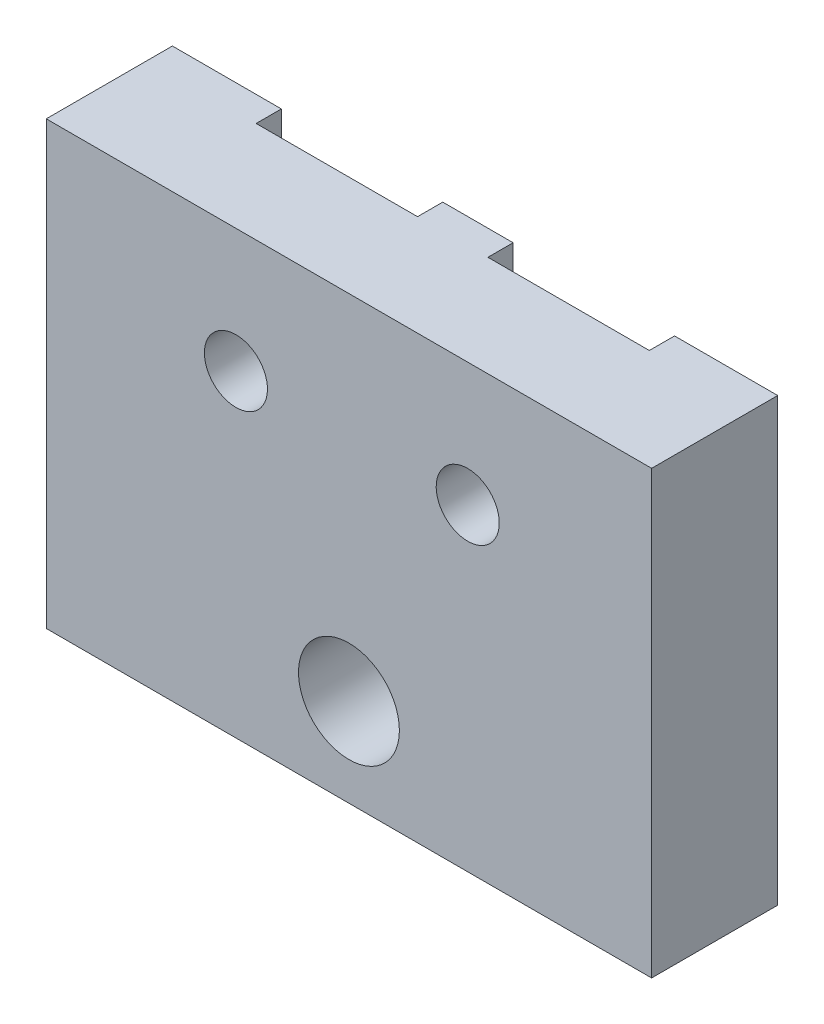
ISO-10303-21;
HEADER;
FILE_DESCRIPTION(('STEP AP214'),'2;1');
FILE_NAME('part.step','',(''),(''),'','','');
FILE_SCHEMA(('AUTOMOTIVE_DESIGN { 1 0 10303 214 1 1 1 1 }'));
ENDSEC;
DATA;
#1=APPLICATION_CONTEXT('core data for automotive mechanical design processes');
#2=APPLICATION_PROTOCOL_DEFINITION('international standard','automotive_design',2000,#1);
#3=PRODUCT_CONTEXT('',#1,'mechanical');
#4=PRODUCT('Part','Part','',(#3));
#5=PRODUCT_RELATED_PRODUCT_CATEGORY('part','',(#4));
#6=PRODUCT_DEFINITION_FORMATION('','',#4);
#7=PRODUCT_DEFINITION_CONTEXT('part definition',#1,'design');
#8=PRODUCT_DEFINITION('design','',#6,#7);
#9=PRODUCT_DEFINITION_SHAPE('','',#8);
#10=(LENGTH_UNIT() NAMED_UNIT(*) SI_UNIT(.MILLI.,.METRE.));
#11=(NAMED_UNIT(*) PLANE_ANGLE_UNIT() SI_UNIT($,.RADIAN.));
#12=(NAMED_UNIT(*) SI_UNIT($,.STERADIAN.) SOLID_ANGLE_UNIT());
#13=UNCERTAINTY_MEASURE_WITH_UNIT(LENGTH_MEASURE(1.E-05),#10,'distance_accuracy_value','');
#14=(GEOMETRIC_REPRESENTATION_CONTEXT(3) GLOBAL_UNCERTAINTY_ASSIGNED_CONTEXT((#13)) GLOBAL_UNIT_ASSIGNED_CONTEXT((#10,
#11,#12)) REPRESENTATION_CONTEXT('',''));
#15=CARTESIAN_POINT('',(0.,0.,0.));
#16=DIRECTION('',(0.,0.,1.));
#17=DIRECTION('',(1.,0.,0.));
#18=AXIS2_PLACEMENT_3D('',#15,#16,#17);
#19=CARTESIAN_POINT('',(-12.,14.,0.));
#20=DIRECTION('',(0.,0.,-1.));
#21=DIRECTION('',(-1.,0.,0.));
#22=AXIS2_PLACEMENT_3D('',#19,#20,#21);
#23=PLANE('',#22);
#24=CARTESIAN_POINT('',(0.,0.,0.));
#25=DIRECTION('',(0.,0.,1.));
#26=DIRECTION('',(1.,0.,0.));
#27=AXIS2_PLACEMENT_3D('',#24,#25,#26);
#28=CIRCLE('',#27,2.);
#29=CARTESIAN_POINT('',(2.,0.,0.));
#30=VERTEX_POINT('',#29);
#31=EDGE_CURVE('E160',#30,#30,#28,.T.);
#32=ORIENTED_EDGE('',*,*,#31,.T.);
#33=EDGE_LOOP('',(#32));
#34=FACE_BOUND('',#33,.T.);
#35=CARTESIAN_POINT('',(4.70912565695362,9.1,0.));
#36=DIRECTION('',(0.,0.,1.));
#37=DIRECTION('',(1.,0.,0.));
#38=AXIS2_PLACEMENT_3D('',#35,#36,#37);
#39=CIRCLE('',#38,3.2);
#40=CARTESIAN_POINT('',(1.50912565695362,9.09999999999999,0.));
#41=VERTEX_POINT('',#40);
#42=CARTESIAN_POINT('',(7.90912565695362,9.1,0.));
#43=VERTEX_POINT('',#42);
#44=EDGE_CURVE('E135',#41,#43,#39,.T.);
#45=ORIENTED_EDGE('',*,*,#44,.T.);
#46=DIRECTION('',(0.,1.,0.));
#47=VECTOR('',#46,1.);
#48=CARTESIAN_POINT('',(7.90912565695362,24.5,0.));
#49=LINE('',#48,#47);
#50=CARTESIAN_POINT('',(7.90912565695362,14.,0.));
#51=VERTEX_POINT('',#50);
#52=EDGE_CURVE('E131',#43,#51,#49,.T.);
#53=ORIENTED_EDGE('',*,*,#52,.T.);
#54=DIRECTION('',(-1.,0.,0.));
#55=VECTOR('',#54,1.);
#56=CARTESIAN_POINT('',(-12.,14.,0.));
#57=LINE('',#56,#55);
#58=CARTESIAN_POINT('',(12.,14.,0.));
#59=VERTEX_POINT('',#58);
#60=EDGE_CURVE('E177',#59,#51,#57,.T.);
#61=ORIENTED_EDGE('',*,*,#60,.F.);
#62=DIRECTION('',(0.,1.,0.));
#63=VECTOR('',#62,1.);
#64=CARTESIAN_POINT('',(12.,-3.5,0.));
#65=LINE('',#64,#63);
#66=CARTESIAN_POINT('',(12.,-3.5,0.));
#67=VERTEX_POINT('',#66);
#68=EDGE_CURVE('E188',#67,#59,#65,.T.);
#69=ORIENTED_EDGE('',*,*,#68,.F.);
#70=DIRECTION('',(1.,0.,0.));
#71=VECTOR('',#70,1.);
#72=CARTESIAN_POINT('',(-12.,-3.5,0.));
#73=LINE('',#72,#71);
#74=CARTESIAN_POINT('',(-12.,-3.5,0.));
#75=VERTEX_POINT('',#74);
#76=EDGE_CURVE('E186',#75,#67,#73,.T.);
#77=ORIENTED_EDGE('',*,*,#76,.F.);
#78=DIRECTION('',(0.,-1.,0.));
#79=VECTOR('',#78,1.);
#80=CARTESIAN_POINT('',(-12.,-3.5,0.));
#81=LINE('',#80,#79);
#82=CARTESIAN_POINT('',(-12.,14.,0.));
#83=VERTEX_POINT('',#82);
#84=EDGE_CURVE('E170',#83,#75,#81,.T.);
#85=ORIENTED_EDGE('',*,*,#84,.F.);
#86=CARTESIAN_POINT('',(-7.68023255639264,14.,0.));
#87=VERTEX_POINT('',#86);
#88=EDGE_CURVE('E190',#87,#83,#57,.T.);
#89=ORIENTED_EDGE('',*,*,#88,.F.);
#90=DIRECTION('',(0.,-1.,0.));
#91=VECTOR('',#90,1.);
#92=CARTESIAN_POINT('',(-7.68023255639264,9.09999999999999,0.));
#93=LINE('',#92,#91);
#94=CARTESIAN_POINT('',(-7.68023255639264,9.09999999999999,0.));
#95=VERTEX_POINT('',#94);
#96=EDGE_CURVE('E125',#87,#95,#93,.T.);
#97=ORIENTED_EDGE('',*,*,#96,.T.);
#98=CARTESIAN_POINT('',(-4.48023255639264,9.1,0.));
#99=DIRECTION('',(0.,0.,1.));
#100=DIRECTION('',(1.,0.,0.));
#101=AXIS2_PLACEMENT_3D('',#98,#99,#100);
#102=CIRCLE('',#101,3.2);
#103=CARTESIAN_POINT('',(-1.28023255639263,9.1,0.));
#104=VERTEX_POINT('',#103);
#105=EDGE_CURVE('E151',#95,#104,#102,.T.);
#106=ORIENTED_EDGE('',*,*,#105,.T.);
#107=DIRECTION('',(0.,1.,0.));
#108=VECTOR('',#107,1.);
#109=CARTESIAN_POINT('',(-1.28023255639264,24.5,0.));
#110=LINE('',#109,#108);
#111=CARTESIAN_POINT('',(-1.28023255639263,14.,0.));
#112=VERTEX_POINT('',#111);
#113=EDGE_CURVE('E147',#104,#112,#110,.T.);
#114=ORIENTED_EDGE('',*,*,#113,.T.);
#115=CARTESIAN_POINT('',(1.50912565695362,14.,0.));
#116=VERTEX_POINT('',#115);
#117=EDGE_CURVE('E193',#116,#112,#57,.T.);
#118=ORIENTED_EDGE('',*,*,#117,.F.);
#119=DIRECTION('',(0.,-1.,0.));
#120=VECTOR('',#119,1.);
#121=CARTESIAN_POINT('',(1.50912565695362,9.09999999999999,0.));
#122=LINE('',#121,#120);
#123=EDGE_CURVE('E141',#116,#41,#122,.T.);
#124=ORIENTED_EDGE('',*,*,#123,.T.);
#125=EDGE_LOOP('',(#45,#53,#61,#69,#77,#85,#89,#97,#106,#114,#118,#124));
#126=FACE_BOUND('',#125,.T.);
#127=ADVANCED_FACE('F30',(#34,#126),#23,.T.);
#128=CARTESIAN_POINT('',(-12.,14.,5.));
#129=DIRECTION('',(0.,-1.,0.));
#130=DIRECTION('',(0.,0.,-1.));
#131=AXIS2_PLACEMENT_3D('',#128,#129,#130);
#132=PLANE('',#131);
#133=DIRECTION('',(0.,0.,-1.));
#134=VECTOR('',#133,1.);
#135=CARTESIAN_POINT('',(7.90912565695362,14.,5.));
#136=LINE('',#135,#134);
#137=CARTESIAN_POINT('',(7.90912565695362,14.,0.999999999999987));
#138=VERTEX_POINT('',#137);
#139=EDGE_CURVE('E11',#138,#51,#136,.T.);
#140=ORIENTED_EDGE('',*,*,#139,.F.);
#141=DIRECTION('',(-1.,0.,0.));
#142=VECTOR('',#141,1.);
#143=CARTESIAN_POINT('',(-12.,14.,0.999999999999993));
#144=LINE('',#143,#142);
#145=CARTESIAN_POINT('',(1.50912565695362,14.,0.999999999999989));
#146=VERTEX_POINT('',#145);
#147=EDGE_CURVE('E122',#138,#146,#144,.T.);
#148=ORIENTED_EDGE('',*,*,#147,.T.);
#149=DIRECTION('',(0.,0.,1.));
#150=VECTOR('',#149,1.);
#151=CARTESIAN_POINT('',(1.50912565695362,14.,5.));
#152=LINE('',#151,#150);
#153=EDGE_CURVE('E38',#116,#146,#152,.T.);
#154=ORIENTED_EDGE('',*,*,#153,.F.);
#155=ORIENTED_EDGE('',*,*,#117,.T.);
#156=DIRECTION('',(0.,0.,-1.));
#157=VECTOR('',#156,1.);
#158=CARTESIAN_POINT('',(-1.28023255639264,14.,5.));
#159=LINE('',#158,#157);
#160=CARTESIAN_POINT('',(-1.28023255639263,14.,0.999999999999991));
#161=VERTEX_POINT('',#160);
#162=EDGE_CURVE('E208',#161,#112,#159,.T.);
#163=ORIENTED_EDGE('',*,*,#162,.F.);
#164=DIRECTION('',(-1.,0.,0.));
#165=VECTOR('',#164,1.);
#166=CARTESIAN_POINT('',(-12.,14.,0.999999999999993));
#167=LINE('',#166,#165);
#168=CARTESIAN_POINT('',(-7.68023255639264,14.,0.999999999999992));
#169=VERTEX_POINT('',#168);
#170=EDGE_CURVE('E205',#161,#169,#167,.T.);
#171=ORIENTED_EDGE('',*,*,#170,.T.);
#172=DIRECTION('',(0.,0.,1.));
#173=VECTOR('',#172,1.);
#174=CARTESIAN_POINT('',(-7.68023255639264,14.,5.));
#175=LINE('',#174,#173);
#176=EDGE_CURVE('E211',#87,#169,#175,.T.);
#177=ORIENTED_EDGE('',*,*,#176,.F.);
#178=ORIENTED_EDGE('',*,*,#88,.T.);
#179=DIRECTION('',(0.,0.,-1.));
#180=VECTOR('',#179,1.);
#181=CARTESIAN_POINT('',(-12.,14.,5.));
#182=LINE('',#181,#180);
#183=CARTESIAN_POINT('',(-12.,14.,5.));
#184=VERTEX_POINT('',#183);
#185=EDGE_CURVE('E183',#184,#83,#182,.T.);
#186=ORIENTED_EDGE('',*,*,#185,.F.);
#187=DIRECTION('',(-1.,0.,0.));
#188=VECTOR('',#187,1.);
#189=CARTESIAN_POINT('',(-12.,14.,5.));
#190=LINE('',#189,#188);
#191=CARTESIAN_POINT('',(12.,14.,5.));
#192=VERTEX_POINT('',#191);
#193=EDGE_CURVE('E181',#192,#184,#190,.T.);
#194=ORIENTED_EDGE('',*,*,#193,.F.);
#195=DIRECTION('',(0.,0.,-1.));
#196=VECTOR('',#195,1.);
#197=CARTESIAN_POINT('',(12.,14.,5.));
#198=LINE('',#197,#196);
#199=EDGE_CURVE('E196',#192,#59,#198,.T.);
#200=ORIENTED_EDGE('',*,*,#199,.T.);
#201=ORIENTED_EDGE('',*,*,#60,.T.);
#202=EDGE_LOOP('',(#140,#148,#154,#155,#163,#171,#177,#178,#186,#194,#200,#201));
#203=FACE_BOUND('',#202,.T.);
#204=ADVANCED_FACE('F219',(#203),#132,.F.);
#205=CARTESIAN_POINT('',(-12.,14.,5.));
#206=DIRECTION('',(0.,0.,-1.));
#207=DIRECTION('',(-1.,0.,0.));
#208=AXIS2_PLACEMENT_3D('',#205,#206,#207);
#209=PLANE('',#208);
#210=CARTESIAN_POINT('',(-4.48023255639264,9.09999999999999,5.00000000000001));
#211=DIRECTION('',(0.,0.,-1.));
#212=DIRECTION('',(0.,1.,0.));
#213=AXIS2_PLACEMENT_3D('',#210,#211,#212);
#214=CIRCLE('',#213,1.25);
#215=CARTESIAN_POINT('',(-4.48023255639264,10.35,5.00000000000001));
#216=VERTEX_POINT('',#215);
#217=EDGE_CURVE('E231',#216,#216,#214,.T.);
#218=ORIENTED_EDGE('',*,*,#217,.T.);
#219=EDGE_LOOP('',(#218));
#220=FACE_BOUND('',#219,.T.);
#221=CARTESIAN_POINT('',(4.70912565695362,9.09999999999999,5.00000000000001));
#222=DIRECTION('',(0.,0.,-1.));
#223=DIRECTION('',(0.,1.,0.));
#224=AXIS2_PLACEMENT_3D('',#221,#222,#223);
#225=CIRCLE('',#224,1.25);
#226=CARTESIAN_POINT('',(4.70912565695362,10.35,5.00000000000001));
#227=VERTEX_POINT('',#226);
#228=EDGE_CURVE('E146',#227,#227,#225,.T.);
#229=ORIENTED_EDGE('',*,*,#228,.T.);
#230=EDGE_LOOP('',(#229));
#231=FACE_BOUND('',#230,.T.);
#232=DIRECTION('',(0.,-1.,0.));
#233=VECTOR('',#232,1.);
#234=CARTESIAN_POINT('',(-12.,-3.5,5.));
#235=LINE('',#234,#233);
#236=CARTESIAN_POINT('',(-12.,-3.5,5.));
#237=VERTEX_POINT('',#236);
#238=EDGE_CURVE('E173',#184,#237,#235,.T.);
#239=ORIENTED_EDGE('',*,*,#238,.T.);
#240=DIRECTION('',(1.,0.,0.));
#241=VECTOR('',#240,1.);
#242=CARTESIAN_POINT('',(-12.,-3.5,5.));
#243=LINE('',#242,#241);
#244=CARTESIAN_POINT('',(12.,-3.5,5.));
#245=VERTEX_POINT('',#244);
#246=EDGE_CURVE('E176',#237,#245,#243,.T.);
#247=ORIENTED_EDGE('',*,*,#246,.T.);
#248=DIRECTION('',(0.,1.,0.));
#249=VECTOR('',#248,1.);
#250=CARTESIAN_POINT('',(12.,-3.5,5.));
#251=LINE('',#250,#249);
#252=EDGE_CURVE('E179',#245,#192,#251,.T.);
#253=ORIENTED_EDGE('',*,*,#252,.T.);
#254=ORIENTED_EDGE('',*,*,#193,.T.);
#255=EDGE_LOOP('',(#239,#247,#253,#254));
#256=FACE_BOUND('',#255,.T.);
#257=CARTESIAN_POINT('',(0.,0.,5.));
#258=DIRECTION('',(0.,0.,1.));
#259=DIRECTION('',(1.,0.,0.));
#260=AXIS2_PLACEMENT_3D('',#257,#258,#259);
#261=CIRCLE('',#260,2.);
#262=CARTESIAN_POINT('',(2.,0.,5.));
#263=VERTEX_POINT('',#262);
#264=EDGE_CURVE('E167',#263,#263,#261,.T.);
#265=ORIENTED_EDGE('',*,*,#264,.F.);
#266=EDGE_LOOP('',(#265));
#267=FACE_BOUND('',#266,.T.);
#268=ADVANCED_FACE('F263',(#220,#231,#256,#267),#209,.F.);
#269=CARTESIAN_POINT('',(-12.,-3.5,5.));
#270=DIRECTION('',(1.,0.,0.));
#271=DIRECTION('',(0.,0.,-1.));
#272=AXIS2_PLACEMENT_3D('',#269,#270,#271);
#273=PLANE('',#272);
#274=ORIENTED_EDGE('',*,*,#84,.T.);
#275=DIRECTION('',(0.,0.,-1.));
#276=VECTOR('',#275,1.);
#277=CARTESIAN_POINT('',(-12.,-3.5,5.));
#278=LINE('',#277,#276);
#279=EDGE_CURVE('E202',#237,#75,#278,.T.);
#280=ORIENTED_EDGE('',*,*,#279,.F.);
#281=ORIENTED_EDGE('',*,*,#238,.F.);
#282=ORIENTED_EDGE('',*,*,#185,.T.);
#283=EDGE_LOOP('',(#274,#280,#281,#282));
#284=FACE_BOUND('',#283,.T.);
#285=ADVANCED_FACE('F32',(#284),#273,.F.);
#286=CARTESIAN_POINT('',(-12.,-3.5,5.));
#287=DIRECTION('',(0.,1.,0.));
#288=DIRECTION('',(0.,0.,1.));
#289=AXIS2_PLACEMENT_3D('',#286,#287,#288);
#290=PLANE('',#289);
#291=ORIENTED_EDGE('',*,*,#76,.T.);
#292=DIRECTION('',(0.,0.,-1.));
#293=VECTOR('',#292,1.);
#294=CARTESIAN_POINT('',(12.,-3.5,5.));
#295=LINE('',#294,#293);
#296=EDGE_CURVE('E199',#245,#67,#295,.T.);
#297=ORIENTED_EDGE('',*,*,#296,.F.);
#298=ORIENTED_EDGE('',*,*,#246,.F.);
#299=ORIENTED_EDGE('',*,*,#279,.T.);
#300=EDGE_LOOP('',(#291,#297,#298,#299));
#301=FACE_BOUND('',#300,.T.);
#302=ADVANCED_FACE('F271',(#301),#290,.F.);
#303=CARTESIAN_POINT('',(12.,-3.5,5.));
#304=DIRECTION('',(-1.,0.,0.));
#305=DIRECTION('',(0.,0.,1.));
#306=AXIS2_PLACEMENT_3D('',#303,#304,#305);
#307=PLANE('',#306);
#308=ORIENTED_EDGE('',*,*,#68,.T.);
#309=ORIENTED_EDGE('',*,*,#199,.F.);
#310=ORIENTED_EDGE('',*,*,#252,.F.);
#311=ORIENTED_EDGE('',*,*,#296,.T.);
#312=EDGE_LOOP('',(#308,#309,#310,#311));
#313=FACE_BOUND('',#312,.T.);
#314=ADVANCED_FACE('F269',(#313),#307,.F.);
#315=CARTESIAN_POINT('',(0.,0.,5.));
#316=DIRECTION('',(0.,0.,-1.));
#317=DIRECTION('',(-1.,0.,0.));
#318=AXIS2_PLACEMENT_3D('',#315,#316,#317);
#319=CYLINDRICAL_SURFACE('',#318,2.);
#320=ORIENTED_EDGE('',*,*,#264,.T.);
#321=EDGE_LOOP('',(#320));
#322=FACE_BOUND('',#321,.T.);
#323=ORIENTED_EDGE('',*,*,#31,.F.);
#324=EDGE_LOOP('',(#323));
#325=FACE_BOUND('',#324,.T.);
#326=ADVANCED_FACE('F277',(#322,#325),#319,.F.);
#327=CARTESIAN_POINT('',(-7.68023255639264,9.09999999999999,20.6702821535432));
#328=DIRECTION('',(1.,0.,0.));
#329=DIRECTION('',(0.,1.,0.));
#330=AXIS2_PLACEMENT_3D('',#327,#328,#329);
#331=PLANE('',#330);
#332=ORIENTED_EDGE('',*,*,#176,.T.);
#333=DIRECTION('',(0.,-1.,0.));
#334=VECTOR('',#333,1.);
#335=CARTESIAN_POINT('',(-7.68023255639264,9.1,0.99999999999999));
#336=LINE('',#335,#334);
#337=CARTESIAN_POINT('',(-7.68023255639264,9.09999999999999,0.99999999999999));
#338=VERTEX_POINT('',#337);
#339=EDGE_CURVE('E53',#169,#338,#336,.T.);
#340=ORIENTED_EDGE('',*,*,#339,.T.);
#341=DIRECTION('',(0.,0.,-1.));
#342=VECTOR('',#341,1.);
#343=CARTESIAN_POINT('',(-7.68023255639264,9.09999999999999,20.6702821535432));
#344=LINE('',#343,#342);
#345=EDGE_CURVE('E154',#338,#95,#344,.T.);
#346=ORIENTED_EDGE('',*,*,#345,.T.);
#347=ORIENTED_EDGE('',*,*,#96,.F.);
#348=EDGE_LOOP('',(#332,#340,#346,#347));
#349=FACE_BOUND('',#348,.T.);
#350=ADVANCED_FACE('F253',(#349),#331,.T.);
#351=CARTESIAN_POINT('',(-1.28023255639264,24.5,20.6702821535432));
#352=DIRECTION('',(-1.,0.,0.));
#353=DIRECTION('',(0.,-1.,0.));
#354=AXIS2_PLACEMENT_3D('',#351,#352,#353);
#355=PLANE('',#354);
#356=ORIENTED_EDGE('',*,*,#162,.T.);
#357=ORIENTED_EDGE('',*,*,#113,.F.);
#358=DIRECTION('',(0.,0.,-1.));
#359=VECTOR('',#358,1.);
#360=CARTESIAN_POINT('',(-1.28023255639263,9.1,20.6702821535432));
#361=LINE('',#360,#359);
#362=CARTESIAN_POINT('',(-1.28023255639263,9.1,0.99999999999999));
#363=VERTEX_POINT('',#362);
#364=EDGE_CURVE('E150',#363,#104,#361,.T.);
#365=ORIENTED_EDGE('',*,*,#364,.F.);
#366=DIRECTION('',(0.,1.,0.));
#367=VECTOR('',#366,1.);
#368=CARTESIAN_POINT('',(-1.28023255639264,24.5,0.999999999999994));
#369=LINE('',#368,#367);
#370=EDGE_CURVE('E157',#363,#161,#369,.T.);
#371=ORIENTED_EDGE('',*,*,#370,.T.);
#372=EDGE_LOOP('',(#356,#357,#365,#371));
#373=FACE_BOUND('',#372,.T.);
#374=ADVANCED_FACE('F243',(#373),#355,.T.);
#375=CARTESIAN_POINT('',(-4.48023255639264,9.1,0.999999999999989));
#376=DIRECTION('',(0.,0.,1.));
#377=DIRECTION('',(0.,1.,0.));
#378=AXIS2_PLACEMENT_3D('',#375,#376,#377);
#379=PLANE('',#378);
#380=CARTESIAN_POINT('',(-4.48023255639264,9.1,0.999999999999987));
#381=DIRECTION('',(0.,0.,-1.));
#382=DIRECTION('',(0.,1.,0.));
#383=AXIS2_PLACEMENT_3D('',#380,#381,#382);
#384=CIRCLE('',#383,1.24999999999999);
#385=CARTESIAN_POINT('',(-4.48023255639264,10.35,0.999999999999988));
#386=VERTEX_POINT('',#385);
#387=EDGE_CURVE('E234',#386,#386,#384,.T.);
#388=ORIENTED_EDGE('',*,*,#387,.F.);
#389=EDGE_LOOP('',(#388));
#390=FACE_BOUND('',#389,.T.);
#391=ORIENTED_EDGE('',*,*,#370,.F.);
#392=CARTESIAN_POINT('',(-4.48023255639264,9.1,0.99999999999999));
#393=DIRECTION('',(0.,0.,1.));
#394=DIRECTION('',(1.,0.,0.));
#395=AXIS2_PLACEMENT_3D('',#392,#393,#394);
#396=CIRCLE('',#395,3.2);
#397=EDGE_CURVE('E161',#338,#363,#396,.T.);
#398=ORIENTED_EDGE('',*,*,#397,.F.);
#399=ORIENTED_EDGE('',*,*,#339,.F.);
#400=ORIENTED_EDGE('',*,*,#170,.F.);
#401=EDGE_LOOP('',(#391,#398,#399,#400));
#402=FACE_BOUND('',#401,.T.);
#403=ADVANCED_FACE('F240',(#390,#402),#379,.F.);
#404=CARTESIAN_POINT('',(-4.48023255639264,9.1,20.6702821535432));
#405=DIRECTION('',(0.,0.,-1.));
#406=DIRECTION('',(-1.,0.,0.));
#407=AXIS2_PLACEMENT_3D('',#404,#405,#406);
#408=CYLINDRICAL_SURFACE('',#407,3.2);
#409=ORIENTED_EDGE('',*,*,#397,.T.);
#410=ORIENTED_EDGE('',*,*,#364,.T.);
#411=ORIENTED_EDGE('',*,*,#105,.F.);
#412=ORIENTED_EDGE('',*,*,#345,.F.);
#413=EDGE_LOOP('',(#409,#410,#411,#412));
#414=FACE_BOUND('',#413,.T.);
#415=ADVANCED_FACE('F242',(#414),#408,.F.);
#416=CARTESIAN_POINT('',(7.90912565695362,24.5,20.6702821535432));
#417=DIRECTION('',(-1.,0.,0.));
#418=DIRECTION('',(0.,-1.,0.));
#419=AXIS2_PLACEMENT_3D('',#416,#417,#418);
#420=PLANE('',#419);
#421=ORIENTED_EDGE('',*,*,#139,.T.);
#422=ORIENTED_EDGE('',*,*,#52,.F.);
#423=DIRECTION('',(0.,0.,-1.));
#424=VECTOR('',#423,1.);
#425=CARTESIAN_POINT('',(7.90912565695362,9.1,20.6702821535432));
#426=LINE('',#425,#424);
#427=CARTESIAN_POINT('',(7.90912565695362,9.1,0.999999999999987));
#428=VERTEX_POINT('',#427);
#429=EDGE_CURVE('E128',#428,#43,#426,.T.);
#430=ORIENTED_EDGE('',*,*,#429,.F.);
#431=DIRECTION('',(0.,1.,0.));
#432=VECTOR('',#431,1.);
#433=CARTESIAN_POINT('',(7.90912565695362,24.5,0.99999999999999));
#434=LINE('',#433,#432);
#435=EDGE_CURVE('E116',#428,#138,#434,.T.);
#436=ORIENTED_EDGE('',*,*,#435,.T.);
#437=EDGE_LOOP('',(#421,#422,#430,#436));
#438=FACE_BOUND('',#437,.T.);
#439=ADVANCED_FACE('F129',(#438),#420,.T.);
#440=CARTESIAN_POINT('',(1.50912565695362,9.09999999999999,20.6702821535432));
#441=DIRECTION('',(1.,0.,0.));
#442=DIRECTION('',(0.,1.,0.));
#443=AXIS2_PLACEMENT_3D('',#440,#441,#442);
#444=PLANE('',#443);
#445=ORIENTED_EDGE('',*,*,#153,.T.);
#446=DIRECTION('',(0.,-1.,0.));
#447=VECTOR('',#446,1.);
#448=CARTESIAN_POINT('',(1.50912565695362,9.1,0.999999999999987));
#449=LINE('',#448,#447);
#450=CARTESIAN_POINT('',(1.50912565695362,9.09999999999999,0.999999999999987));
#451=VERTEX_POINT('',#450);
#452=EDGE_CURVE('E45',#146,#451,#449,.T.);
#453=ORIENTED_EDGE('',*,*,#452,.T.);
#454=DIRECTION('',(0.,0.,-1.));
#455=VECTOR('',#454,1.);
#456=CARTESIAN_POINT('',(1.50912565695362,9.09999999999999,20.6702821535432));
#457=LINE('',#456,#455);
#458=EDGE_CURVE('E139',#451,#41,#457,.T.);
#459=ORIENTED_EDGE('',*,*,#458,.T.);
#460=ORIENTED_EDGE('',*,*,#123,.F.);
#461=EDGE_LOOP('',(#445,#453,#459,#460));
#462=FACE_BOUND('',#461,.T.);
#463=ADVANCED_FACE('F215',(#462),#444,.T.);
#464=CARTESIAN_POINT('',(-4.48023255639264,9.1,0.999999999999989));
#465=DIRECTION('',(0.,0.,1.));
#466=DIRECTION('',(0.,1.,0.));
#467=AXIS2_PLACEMENT_3D('',#464,#465,#466);
#468=PLANE('',#467);
#469=CARTESIAN_POINT('',(4.70912565695362,9.1,0.999999999999984));
#470=DIRECTION('',(0.,0.,-1.));
#471=DIRECTION('',(0.,1.,0.));
#472=AXIS2_PLACEMENT_3D('',#469,#470,#471);
#473=CIRCLE('',#472,1.24999999999999);
#474=CARTESIAN_POINT('',(4.70912565695362,10.35,0.999999999999985));
#475=VERTEX_POINT('',#474);
#476=EDGE_CURVE('E228',#475,#475,#473,.T.);
#477=ORIENTED_EDGE('',*,*,#476,.F.);
#478=EDGE_LOOP('',(#477));
#479=FACE_BOUND('',#478,.T.);
#480=ORIENTED_EDGE('',*,*,#435,.F.);
#481=CARTESIAN_POINT('',(4.70912565695362,9.1,0.999999999999987));
#482=DIRECTION('',(0.,0.,1.));
#483=DIRECTION('',(1.,0.,0.));
#484=AXIS2_PLACEMENT_3D('',#481,#482,#483);
#485=CIRCLE('',#484,3.2);
#486=EDGE_CURVE('E120',#451,#428,#485,.T.);
#487=ORIENTED_EDGE('',*,*,#486,.F.);
#488=ORIENTED_EDGE('',*,*,#452,.F.);
#489=ORIENTED_EDGE('',*,*,#147,.F.);
#490=EDGE_LOOP('',(#480,#487,#488,#489));
#491=FACE_BOUND('',#490,.T.);
#492=ADVANCED_FACE('F118',(#479,#491),#468,.F.);
#493=CARTESIAN_POINT('',(4.70912565695362,9.1,20.6702821535432));
#494=DIRECTION('',(0.,0.,-1.));
#495=DIRECTION('',(-1.,0.,0.));
#496=AXIS2_PLACEMENT_3D('',#493,#494,#495);
#497=CYLINDRICAL_SURFACE('',#496,3.2);
#498=ORIENTED_EDGE('',*,*,#486,.T.);
#499=ORIENTED_EDGE('',*,*,#429,.T.);
#500=ORIENTED_EDGE('',*,*,#44,.F.);
#501=ORIENTED_EDGE('',*,*,#458,.F.);
#502=EDGE_LOOP('',(#498,#499,#500,#501));
#503=FACE_BOUND('',#502,.T.);
#504=ADVANCED_FACE('F138',(#503),#497,.F.);
#505=CARTESIAN_POINT('',(4.70912565695362,9.1,0.999999999999986));
#506=DIRECTION('',(0.,0.,-1.));
#507=DIRECTION('',(0.,1.,0.));
#508=AXIS2_PLACEMENT_3D('',#505,#506,#507);
#509=CYLINDRICAL_SURFACE('',#508,1.24999999999999);
#510=ORIENTED_EDGE('',*,*,#228,.F.);
#511=EDGE_LOOP('',(#510));
#512=FACE_BOUND('',#511,.T.);
#513=ORIENTED_EDGE('',*,*,#476,.T.);
#514=EDGE_LOOP('',(#513));
#515=FACE_BOUND('',#514,.T.);
#516=ADVANCED_FACE('F304',(#512,#515),#509,.F.);
#517=CARTESIAN_POINT('',(-4.48023255639264,9.1,0.999999999999989));
#518=DIRECTION('',(0.,0.,-1.));
#519=DIRECTION('',(0.,1.,0.));
#520=AXIS2_PLACEMENT_3D('',#517,#518,#519);
#521=CYLINDRICAL_SURFACE('',#520,1.24999999999999);
#522=ORIENTED_EDGE('',*,*,#217,.F.);
#523=EDGE_LOOP('',(#522));
#524=FACE_BOUND('',#523,.T.);
#525=ORIENTED_EDGE('',*,*,#387,.T.);
#526=EDGE_LOOP('',(#525));
#527=FACE_BOUND('',#526,.T.);
#528=ADVANCED_FACE('F238',(#524,#527),#521,.F.);
#529=CLOSED_SHELL('',(#127,#204,#268,#285,#302,#314,#326,#350,#374,#403,#415,#439,#463,#492,
#504,#516,#528));
#530=MANIFOLD_SOLID_BREP('B2',#529);
#531=ADVANCED_BREP_SHAPE_REPRESENTATION('',(#18,#530),#14);
#532=SHAPE_DEFINITION_REPRESENTATION(#9,#531);
ENDSEC;
END-ISO-10303-21;
